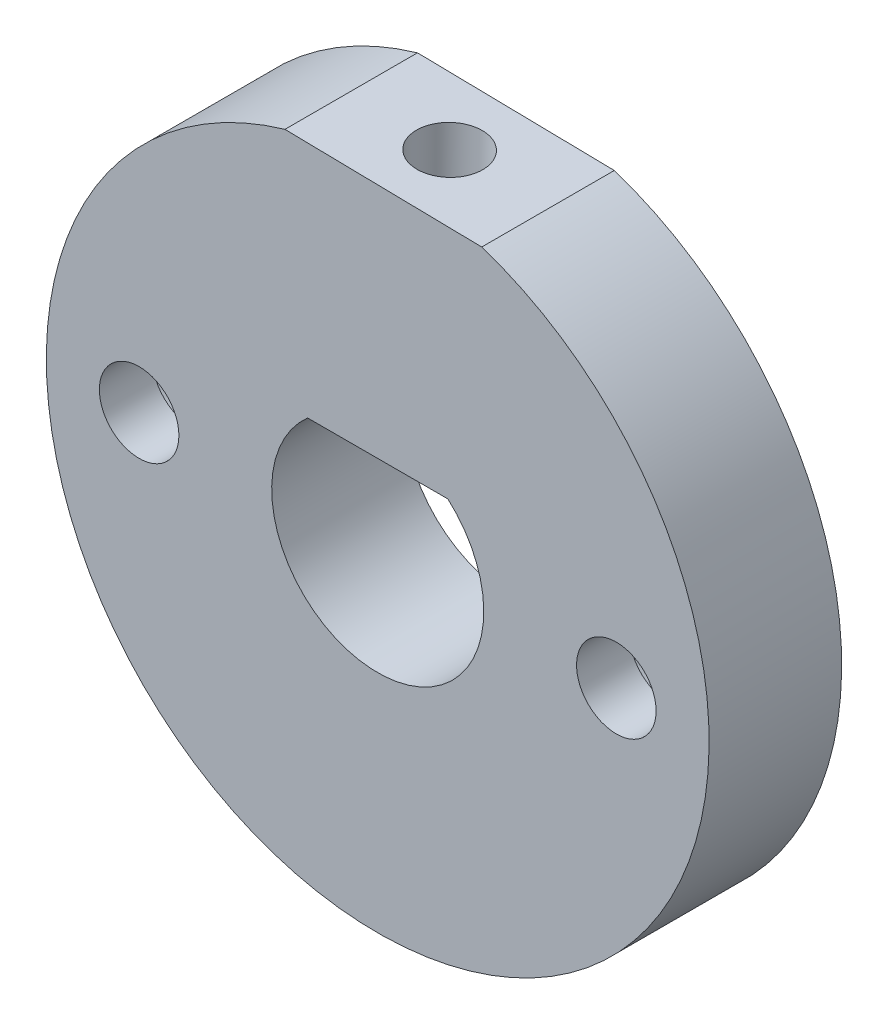
ISO-10303-21;
HEADER;
FILE_DESCRIPTION(('STEP AP214'),'2;1');
FILE_NAME('part.step','',(''),(''),'','','');
FILE_SCHEMA(('AUTOMOTIVE_DESIGN { 1 0 10303 214 1 1 1 1 }'));
ENDSEC;
DATA;
#1=APPLICATION_CONTEXT('core data for automotive mechanical design processes');
#2=APPLICATION_PROTOCOL_DEFINITION('international standard','automotive_design',2000,#1);
#3=PRODUCT_CONTEXT('',#1,'mechanical');
#4=PRODUCT('Part','Part','',(#3));
#5=PRODUCT_RELATED_PRODUCT_CATEGORY('part','',(#4));
#6=PRODUCT_DEFINITION_FORMATION('','',#4);
#7=PRODUCT_DEFINITION_CONTEXT('part definition',#1,'design');
#8=PRODUCT_DEFINITION('design','',#6,#7);
#9=PRODUCT_DEFINITION_SHAPE('','',#8);
#10=(LENGTH_UNIT() NAMED_UNIT(*) SI_UNIT(.MILLI.,.METRE.));
#11=(NAMED_UNIT(*) PLANE_ANGLE_UNIT() SI_UNIT($,.RADIAN.));
#12=(NAMED_UNIT(*) SI_UNIT($,.STERADIAN.) SOLID_ANGLE_UNIT());
#13=UNCERTAINTY_MEASURE_WITH_UNIT(LENGTH_MEASURE(1.E-05),#10,'distance_accuracy_value','');
#14=(GEOMETRIC_REPRESENTATION_CONTEXT(3) GLOBAL_UNCERTAINTY_ASSIGNED_CONTEXT((#13)) GLOBAL_UNIT_ASSIGNED_CONTEXT((#10,
#11,#12)) REPRESENTATION_CONTEXT('',''));
#15=CARTESIAN_POINT('',(0.,0.,0.));
#16=DIRECTION('',(0.,0.,1.));
#17=DIRECTION('',(1.,0.,0.));
#18=AXIS2_PLACEMENT_3D('',#15,#16,#17);
#19=CARTESIAN_POINT('',(0.211849383444167,11.9341087786356,5.));
#20=DIRECTION('',(0.0177487918360335,0.999842477787557,0.));
#21=DIRECTION('',(-0.999842477787557,0.0177487918360335,0.));
#22=AXIS2_PLACEMENT_3D('',#19,#20,#21);
#23=PLANE('',#22);
#24=CARTESIAN_POINT('',(0.211849383444166,11.9341087786356,2.5));
#25=DIRECTION('',(0.0177487918360335,0.999842477787557,0.));
#26=DIRECTION('',(-0.999842477787557,0.0177487918360335,0.));
#27=AXIS2_PLACEMENT_3D('',#24,#25,#26);
#28=CIRCLE('',#27,1.25);
#29=CARTESIAN_POINT('',(-1.03795371379028,11.9562947684306,2.5));
#30=VERTEX_POINT('',#29);
#31=EDGE_CURVE('E86',#30,#30,#28,.T.);
#32=ORIENTED_EDGE('',*,*,#31,.F.);
#33=EDGE_LOOP('',(#32));
#34=FACE_BOUND('',#33,.T.);
#35=DIRECTION('',(0.999842477787557,-0.0177487918360335,0.));
#36=VECTOR('',#35,1.);
#37=CARTESIAN_POINT('',(0.211849383444167,11.9341087786356,0.));
#38=LINE('',#37,#36);
#39=CARTESIAN_POINT('',(-3.5,12.,0.));
#40=VERTEX_POINT('',#39);
#41=CARTESIAN_POINT('',(3.92369876688834,11.8682175572711,0.));
#42=VERTEX_POINT('',#41);
#43=EDGE_CURVE('E83',#40,#42,#38,.T.);
#44=ORIENTED_EDGE('',*,*,#43,.F.);
#45=DIRECTION('',(0.,0.,-1.));
#46=VECTOR('',#45,1.);
#47=CARTESIAN_POINT('',(-3.5,12.,5.));
#48=LINE('',#47,#46);
#49=CARTESIAN_POINT('',(-3.5,12.,5.));
#50=VERTEX_POINT('',#49);
#51=EDGE_CURVE('E11',#50,#40,#48,.T.);
#52=ORIENTED_EDGE('',*,*,#51,.F.);
#53=DIRECTION('',(0.999842477787557,-0.0177487918360335,0.));
#54=VECTOR('',#53,1.);
#55=CARTESIAN_POINT('',(0.211849383444167,11.9341087786356,5.));
#56=LINE('',#55,#54);
#57=CARTESIAN_POINT('',(3.92369876688834,11.8682175572711,5.));
#58=VERTEX_POINT('',#57);
#59=EDGE_CURVE('E94',#50,#58,#56,.T.);
#60=ORIENTED_EDGE('',*,*,#59,.T.);
#61=DIRECTION('',(0.,0.,-1.));
#62=VECTOR('',#61,1.);
#63=CARTESIAN_POINT('',(3.92369876688834,11.8682175572711,5.));
#64=LINE('',#63,#62);
#65=EDGE_CURVE('E27',#58,#42,#64,.T.);
#66=ORIENTED_EDGE('',*,*,#65,.T.);
#67=EDGE_LOOP('',(#44,#52,#60,#66));
#68=FACE_BOUND('',#67,.T.);
#69=ADVANCED_FACE('F17',(#34,#68),#23,.T.);
#70=CARTESIAN_POINT('',(0.,0.,5.));
#71=DIRECTION('',(0.,0.,-1.));
#72=DIRECTION('',(-1.,0.,0.));
#73=AXIS2_PLACEMENT_3D('',#70,#71,#72);
#74=CYLINDRICAL_SURFACE('',#73,4.);
#75=CARTESIAN_POINT('',(0.,0.,0.));
#76=DIRECTION('',(0.,0.,1.));
#77=DIRECTION('',(1.,0.,0.));
#78=AXIS2_PLACEMENT_3D('',#75,#76,#77);
#79=CIRCLE('',#78,4.);
#80=CARTESIAN_POINT('',(-2.64575131106459,3.,0.));
#81=VERTEX_POINT('',#80);
#82=CARTESIAN_POINT('',(2.64575131106459,3.,0.));
#83=VERTEX_POINT('',#82);
#84=EDGE_CURVE('E97',#81,#83,#79,.T.);
#85=ORIENTED_EDGE('',*,*,#84,.F.);
#86=DIRECTION('',(0.,0.,-1.));
#87=VECTOR('',#86,1.);
#88=CARTESIAN_POINT('',(-2.64575131106459,3.,5.));
#89=LINE('',#88,#87);
#90=CARTESIAN_POINT('',(-2.64575131106459,3.,5.));
#91=VERTEX_POINT('',#90);
#92=EDGE_CURVE('E61',#91,#81,#89,.T.);
#93=ORIENTED_EDGE('',*,*,#92,.F.);
#94=CARTESIAN_POINT('',(0.,0.,5.));
#95=DIRECTION('',(0.,0.,1.));
#96=DIRECTION('',(1.,0.,0.));
#97=AXIS2_PLACEMENT_3D('',#94,#95,#96);
#98=CIRCLE('',#97,4.);
#99=CARTESIAN_POINT('',(2.64575131106459,3.,5.));
#100=VERTEX_POINT('',#99);
#101=EDGE_CURVE('E70',#91,#100,#98,.T.);
#102=ORIENTED_EDGE('',*,*,#101,.T.);
#103=DIRECTION('',(0.,0.,-1.));
#104=VECTOR('',#103,1.);
#105=CARTESIAN_POINT('',(2.64575131106459,3.,5.));
#106=LINE('',#105,#104);
#107=EDGE_CURVE('E75',#100,#83,#106,.T.);
#108=ORIENTED_EDGE('',*,*,#107,.T.);
#109=EDGE_LOOP('',(#85,#93,#102,#108));
#110=FACE_BOUND('',#109,.T.);
#111=ADVANCED_FACE('F19',(#110),#74,.F.);
#112=CARTESIAN_POINT('',(9.,0.,5.));
#113=DIRECTION('',(0.,0.,-1.));
#114=DIRECTION('',(-1.,0.,0.));
#115=AXIS2_PLACEMENT_3D('',#112,#113,#114);
#116=CYLINDRICAL_SURFACE('',#115,1.5);
#117=CARTESIAN_POINT('',(9.,0.,3.));
#118=DIRECTION('',(0.,0.,1.));
#119=DIRECTION('',(1.,0.,0.));
#120=AXIS2_PLACEMENT_3D('',#117,#118,#119);
#121=CIRCLE('',#120,1.5);
#122=CARTESIAN_POINT('',(10.5,0.,3.));
#123=VERTEX_POINT('',#122);
#124=EDGE_CURVE('E21',#123,#123,#121,.T.);
#125=ORIENTED_EDGE('',*,*,#124,.F.);
#126=EDGE_LOOP('',(#125));
#127=FACE_BOUND('',#126,.T.);
#128=CARTESIAN_POINT('',(9.,0.,5.));
#129=DIRECTION('',(0.,0.,1.));
#130=DIRECTION('',(1.,0.,0.));
#131=AXIS2_PLACEMENT_3D('',#128,#129,#130);
#132=CIRCLE('',#131,1.5);
#133=CARTESIAN_POINT('',(10.5,0.,5.));
#134=VERTEX_POINT('',#133);
#135=EDGE_CURVE('E91',#134,#134,#132,.T.);
#136=ORIENTED_EDGE('',*,*,#135,.T.);
#137=EDGE_LOOP('',(#136));
#138=FACE_BOUND('',#137,.T.);
#139=ADVANCED_FACE('F153',(#127,#138),#116,.F.);
#140=CARTESIAN_POINT('',(-9.,0.,5.));
#141=DIRECTION('',(0.,0.,-1.));
#142=DIRECTION('',(-1.,0.,0.));
#143=AXIS2_PLACEMENT_3D('',#140,#141,#142);
#144=CYLINDRICAL_SURFACE('',#143,1.5);
#145=CARTESIAN_POINT('',(-9.,0.,3.));
#146=DIRECTION('',(0.,0.,1.));
#147=DIRECTION('',(1.,0.,0.));
#148=AXIS2_PLACEMENT_3D('',#145,#146,#147);
#149=CIRCLE('',#148,1.5);
#150=CARTESIAN_POINT('',(-7.5,0.,3.));
#151=VERTEX_POINT('',#150);
#152=EDGE_CURVE('E106',#151,#151,#149,.T.);
#153=ORIENTED_EDGE('',*,*,#152,.F.);
#154=EDGE_LOOP('',(#153));
#155=FACE_BOUND('',#154,.T.);
#156=CARTESIAN_POINT('',(-9.,0.,5.));
#157=DIRECTION('',(0.,0.,1.));
#158=DIRECTION('',(1.,0.,0.));
#159=AXIS2_PLACEMENT_3D('',#156,#157,#158);
#160=CIRCLE('',#159,1.5);
#161=CARTESIAN_POINT('',(-7.5,0.,5.));
#162=VERTEX_POINT('',#161);
#163=EDGE_CURVE('E72',#162,#162,#160,.T.);
#164=ORIENTED_EDGE('',*,*,#163,.T.);
#165=EDGE_LOOP('',(#164));
#166=FACE_BOUND('',#165,.T.);
#167=ADVANCED_FACE('F161',(#155,#166),#144,.F.);
#168=CARTESIAN_POINT('',(0.,3.,5.));
#169=DIRECTION('',(0.,1.,0.));
#170=DIRECTION('',(0.,0.,1.));
#171=AXIS2_PLACEMENT_3D('',#168,#169,#170);
#172=PLANE('',#171);
#173=CARTESIAN_POINT('',(0.0532547643163977,3.,2.5));
#174=DIRECTION('',(0.,1.,0.));
#175=DIRECTION('',(1.,0.,0.));
#176=AXIS2_PLACEMENT_3D('',#173,#174,#175);
#177=ELLIPSE('',#176,1.250196933787,1.25);
#178=CARTESIAN_POINT('',(1.3034516981034,3.,2.5));
#179=VERTEX_POINT('',#178);
#180=EDGE_CURVE('E99',#179,#179,#177,.T.);
#181=ORIENTED_EDGE('',*,*,#180,.T.);
#182=EDGE_LOOP('',(#181));
#183=FACE_BOUND('',#182,.T.);
#184=DIRECTION('',(1.,0.,0.));
#185=VECTOR('',#184,1.);
#186=CARTESIAN_POINT('',(0.,3.,0.));
#187=LINE('',#186,#185);
#188=EDGE_CURVE('E78',#81,#83,#187,.T.);
#189=ORIENTED_EDGE('',*,*,#188,.T.);
#190=ORIENTED_EDGE('',*,*,#107,.F.);
#191=DIRECTION('',(1.,0.,0.));
#192=VECTOR('',#191,1.);
#193=CARTESIAN_POINT('',(0.,3.,5.));
#194=LINE('',#193,#192);
#195=EDGE_CURVE('E66',#91,#100,#194,.T.);
#196=ORIENTED_EDGE('',*,*,#195,.F.);
#197=ORIENTED_EDGE('',*,*,#92,.T.);
#198=EDGE_LOOP('',(#189,#190,#196,#197));
#199=FACE_BOUND('',#198,.T.);
#200=ADVANCED_FACE('F76',(#183,#199),#172,.F.);
#201=CARTESIAN_POINT('',(0.,0.,5.));
#202=DIRECTION('',(0.,0.,-1.));
#203=DIRECTION('',(-1.,0.,0.));
#204=AXIS2_PLACEMENT_3D('',#201,#202,#203);
#205=CYLINDRICAL_SURFACE('',#204,12.5);
#206=CARTESIAN_POINT('',(0.,0.,0.));
#207=DIRECTION('',(0.,0.,1.));
#208=DIRECTION('',(1.,0.,0.));
#209=AXIS2_PLACEMENT_3D('',#206,#207,#208);
#210=CIRCLE('',#209,12.5);
#211=EDGE_CURVE('E81',#40,#42,#210,.T.);
#212=ORIENTED_EDGE('',*,*,#211,.T.);
#213=ORIENTED_EDGE('',*,*,#65,.F.);
#214=CARTESIAN_POINT('',(0.,0.,5.));
#215=DIRECTION('',(0.,0.,1.));
#216=DIRECTION('',(1.,0.,0.));
#217=AXIS2_PLACEMENT_3D('',#214,#215,#216);
#218=CIRCLE('',#217,12.5);
#219=EDGE_CURVE('E35',#50,#58,#218,.T.);
#220=ORIENTED_EDGE('',*,*,#219,.F.);
#221=ORIENTED_EDGE('',*,*,#51,.T.);
#222=EDGE_LOOP('',(#212,#213,#220,#221));
#223=FACE_BOUND('',#222,.T.);
#224=ADVANCED_FACE('F157',(#223),#205,.T.);
#225=CARTESIAN_POINT('',(0.,0.,5.));
#226=DIRECTION('',(0.,0.,1.));
#227=DIRECTION('',(1.,0.,0.));
#228=AXIS2_PLACEMENT_3D('',#225,#226,#227);
#229=PLANE('',#228);
#230=ORIENTED_EDGE('',*,*,#101,.F.);
#231=ORIENTED_EDGE('',*,*,#195,.T.);
#232=EDGE_LOOP('',(#230,#231));
#233=FACE_BOUND('',#232,.T.);
#234=ORIENTED_EDGE('',*,*,#163,.F.);
#235=EDGE_LOOP('',(#234));
#236=FACE_BOUND('',#235,.T.);
#237=ORIENTED_EDGE('',*,*,#135,.F.);
#238=EDGE_LOOP('',(#237));
#239=FACE_BOUND('',#238,.T.);
#240=ORIENTED_EDGE('',*,*,#59,.F.);
#241=ORIENTED_EDGE('',*,*,#219,.T.);
#242=EDGE_LOOP('',(#240,#241));
#243=FACE_BOUND('',#242,.T.);
#244=ADVANCED_FACE('F68',(#233,#236,#239,#243),#229,.T.);
#245=CARTESIAN_POINT('',(0.,0.,0.));
#246=DIRECTION('',(0.,0.,1.));
#247=DIRECTION('',(1.,0.,0.));
#248=AXIS2_PLACEMENT_3D('',#245,#246,#247);
#249=PLANE('',#248);
#250=CARTESIAN_POINT('',(-9.,0.,0.));
#251=DIRECTION('',(0.,0.,1.));
#252=DIRECTION('',(1.,0.,0.));
#253=AXIS2_PLACEMENT_3D('',#250,#251,#252);
#254=CIRCLE('',#253,3.);
#255=CARTESIAN_POINT('',(-6.,0.,0.));
#256=VERTEX_POINT('',#255);
#257=EDGE_CURVE('E113',#256,#256,#254,.T.);
#258=ORIENTED_EDGE('',*,*,#257,.T.);
#259=EDGE_LOOP('',(#258));
#260=FACE_BOUND('',#259,.T.);
#261=CARTESIAN_POINT('',(9.,0.,0.));
#262=DIRECTION('',(0.,0.,1.));
#263=DIRECTION('',(1.,0.,0.));
#264=AXIS2_PLACEMENT_3D('',#261,#262,#263);
#265=CIRCLE('',#264,3.);
#266=CARTESIAN_POINT('',(12.,0.,0.));
#267=VERTEX_POINT('',#266);
#268=EDGE_CURVE('E122',#267,#267,#265,.T.);
#269=ORIENTED_EDGE('',*,*,#268,.T.);
#270=EDGE_LOOP('',(#269));
#271=FACE_BOUND('',#270,.T.);
#272=ORIENTED_EDGE('',*,*,#84,.T.);
#273=ORIENTED_EDGE('',*,*,#188,.F.);
#274=EDGE_LOOP('',(#272,#273));
#275=FACE_BOUND('',#274,.T.);
#276=ORIENTED_EDGE('',*,*,#43,.T.);
#277=ORIENTED_EDGE('',*,*,#211,.F.);
#278=EDGE_LOOP('',(#276,#277));
#279=FACE_BOUND('',#278,.T.);
#280=ADVANCED_FACE('F126',(#260,#271,#275,#279),#249,.F.);
#281=CARTESIAN_POINT('',(0.0343614650838316,1.93568400076,2.5));
#282=DIRECTION('',(0.0177487918360335,0.999842477787557,0.));
#283=DIRECTION('',(-0.999842477787557,0.0177487918360335,0.));
#284=AXIS2_PLACEMENT_3D('',#281,#282,#283);
#285=CYLINDRICAL_SURFACE('',#284,1.25);
#286=ORIENTED_EDGE('',*,*,#31,.T.);
#287=EDGE_LOOP('',(#286));
#288=FACE_BOUND('',#287,.T.);
#289=ORIENTED_EDGE('',*,*,#180,.F.);
#290=EDGE_LOOP('',(#289));
#291=FACE_BOUND('',#290,.T.);
#292=ADVANCED_FACE('F132',(#288,#291),#285,.F.);
#293=CARTESIAN_POINT('',(9.,0.,3.));
#294=DIRECTION('',(0.,0.,-1.));
#295=DIRECTION('',(-1.,0.,0.));
#296=AXIS2_PLACEMENT_3D('',#293,#294,#295);
#297=CYLINDRICAL_SURFACE('',#296,3.);
#298=CARTESIAN_POINT('',(9.,0.,3.));
#299=DIRECTION('',(0.,0.,1.));
#300=DIRECTION('',(1.,0.,0.));
#301=AXIS2_PLACEMENT_3D('',#298,#299,#300);
#302=CIRCLE('',#301,3.);
#303=CARTESIAN_POINT('',(12.,0.,3.));
#304=VERTEX_POINT('',#303);
#305=EDGE_CURVE('E118',#304,#304,#302,.T.);
#306=ORIENTED_EDGE('',*,*,#305,.T.);
#307=EDGE_LOOP('',(#306));
#308=FACE_BOUND('',#307,.T.);
#309=ORIENTED_EDGE('',*,*,#268,.F.);
#310=EDGE_LOOP('',(#309));
#311=FACE_BOUND('',#310,.T.);
#312=ADVANCED_FACE('F129',(#308,#311),#297,.F.);
#313=CARTESIAN_POINT('',(9.,0.,3.));
#314=DIRECTION('',(0.,0.,1.));
#315=DIRECTION('',(1.,0.,0.));
#316=AXIS2_PLACEMENT_3D('',#313,#314,#315);
#317=PLANE('',#316);
#318=ORIENTED_EDGE('',*,*,#124,.T.);
#319=EDGE_LOOP('',(#318));
#320=FACE_BOUND('',#319,.T.);
#321=ORIENTED_EDGE('',*,*,#305,.F.);
#322=EDGE_LOOP('',(#321));
#323=FACE_BOUND('',#322,.T.);
#324=ADVANCED_FACE('F131',(#320,#323),#317,.F.);
#325=CARTESIAN_POINT('',(-9.,0.,3.));
#326=DIRECTION('',(0.,0.,-1.));
#327=DIRECTION('',(-1.,0.,0.));
#328=AXIS2_PLACEMENT_3D('',#325,#326,#327);
#329=CYLINDRICAL_SURFACE('',#328,3.);
#330=CARTESIAN_POINT('',(-9.,0.,3.));
#331=DIRECTION('',(0.,0.,1.));
#332=DIRECTION('',(1.,0.,0.));
#333=AXIS2_PLACEMENT_3D('',#330,#331,#332);
#334=CIRCLE('',#333,3.);
#335=CARTESIAN_POINT('',(-6.,0.,3.));
#336=VERTEX_POINT('',#335);
#337=EDGE_CURVE('E108',#336,#336,#334,.T.);
#338=ORIENTED_EDGE('',*,*,#337,.T.);
#339=EDGE_LOOP('',(#338));
#340=FACE_BOUND('',#339,.T.);
#341=ORIENTED_EDGE('',*,*,#257,.F.);
#342=EDGE_LOOP('',(#341));
#343=FACE_BOUND('',#342,.T.);
#344=ADVANCED_FACE('F141',(#340,#343),#329,.F.);
#345=CARTESIAN_POINT('',(-9.,0.,3.));
#346=DIRECTION('',(0.,0.,1.));
#347=DIRECTION('',(1.,0.,0.));
#348=AXIS2_PLACEMENT_3D('',#345,#346,#347);
#349=PLANE('',#348);
#350=ORIENTED_EDGE('',*,*,#152,.T.);
#351=EDGE_LOOP('',(#350));
#352=FACE_BOUND('',#351,.T.);
#353=ORIENTED_EDGE('',*,*,#337,.F.);
#354=EDGE_LOOP('',(#353));
#355=FACE_BOUND('',#354,.T.);
#356=ADVANCED_FACE('F187',(#352,#355),#349,.F.);
#357=CLOSED_SHELL('',(#69,#111,#139,#167,#200,#224,#244,#280,#292,#312,#324,#344,#356));
#358=MANIFOLD_SOLID_BREP('B1',#357);
#359=ADVANCED_BREP_SHAPE_REPRESENTATION('',(#18,#358),#14);
#360=SHAPE_DEFINITION_REPRESENTATION(#9,#359);
ENDSEC;
END-ISO-10303-21;
